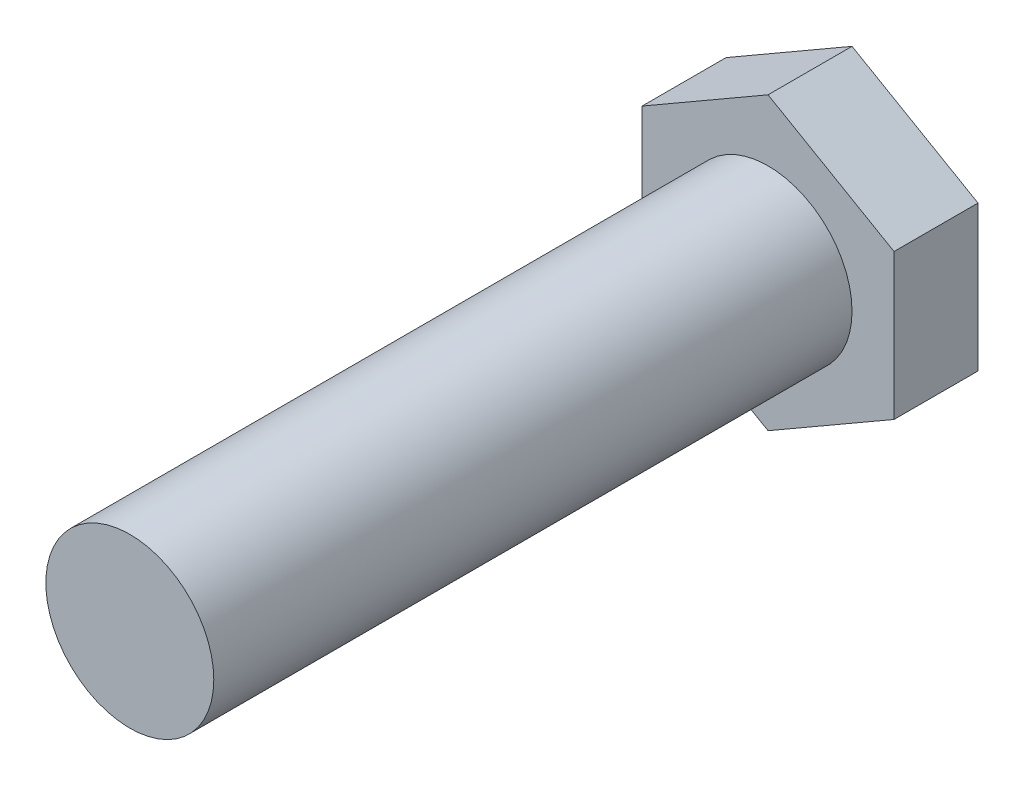
ISO-10303-21;
HEADER;
FILE_DESCRIPTION(('STEP AP214'),'2;1');
FILE_NAME('part.step','',(''),(''),'','','');
FILE_SCHEMA(('AUTOMOTIVE_DESIGN { 1 0 10303 214 1 1 1 1 }'));
ENDSEC;
DATA;
#1=APPLICATION_CONTEXT('core data for automotive mechanical design processes');
#2=APPLICATION_PROTOCOL_DEFINITION('international standard','automotive_design',2000,#1);
#3=PRODUCT_CONTEXT('',#1,'mechanical');
#4=PRODUCT('Part','Part','',(#3));
#5=PRODUCT_RELATED_PRODUCT_CATEGORY('part','',(#4));
#6=PRODUCT_DEFINITION_FORMATION('','',#4);
#7=PRODUCT_DEFINITION_CONTEXT('part definition',#1,'design');
#8=PRODUCT_DEFINITION('design','',#6,#7);
#9=PRODUCT_DEFINITION_SHAPE('','',#8);
#10=(LENGTH_UNIT() NAMED_UNIT(*) SI_UNIT(.MILLI.,.METRE.));
#11=(NAMED_UNIT(*) PLANE_ANGLE_UNIT() SI_UNIT($,.RADIAN.));
#12=(NAMED_UNIT(*) SI_UNIT($,.STERADIAN.) SOLID_ANGLE_UNIT());
#13=UNCERTAINTY_MEASURE_WITH_UNIT(LENGTH_MEASURE(1.E-05),#10,'distance_accuracy_value','');
#14=(GEOMETRIC_REPRESENTATION_CONTEXT(3) GLOBAL_UNCERTAINTY_ASSIGNED_CONTEXT((#13)) GLOBAL_UNIT_ASSIGNED_CONTEXT((#10,
#11,#12)) REPRESENTATION_CONTEXT('',''));
#15=CARTESIAN_POINT('',(0.,0.,0.));
#16=DIRECTION('',(0.,0.,1.));
#17=DIRECTION('',(1.,0.,0.));
#18=AXIS2_PLACEMENT_3D('',#15,#16,#17);
#19=CARTESIAN_POINT('',(7.5,4.3301270189222,5.));
#20=DIRECTION('',(-0.5,-0.866025403784439,0.));
#21=DIRECTION('',(0.866025403784439,-0.5,0.));
#22=AXIS2_PLACEMENT_3D('',#19,#20,#21);
#23=PLANE('',#22);
#24=DIRECTION('',(-0.866025403784439,0.5,0.));
#25=VECTOR('',#24,1.);
#26=CARTESIAN_POINT('',(7.5,4.3301270189222,0.));
#27=LINE('',#26,#25);
#28=CARTESIAN_POINT('',(7.5,4.3301270189222,0.));
#29=VERTEX_POINT('',#28);
#30=CARTESIAN_POINT('',(0.,8.66025403784439,0.));
#31=VERTEX_POINT('',#30);
#32=EDGE_CURVE('E129',#29,#31,#27,.T.);
#33=ORIENTED_EDGE('',*,*,#32,.T.);
#34=DIRECTION('',(0.,0.,-1.));
#35=VECTOR('',#34,1.);
#36=CARTESIAN_POINT('',(0.,8.66025403784439,5.));
#37=LINE('',#36,#35);
#38=CARTESIAN_POINT('',(0.,8.66025403784439,5.));
#39=VERTEX_POINT('',#38);
#40=EDGE_CURVE('E46',#39,#31,#37,.T.);
#41=ORIENTED_EDGE('',*,*,#40,.F.);
#42=DIRECTION('',(-0.866025403784439,0.5,0.));
#43=VECTOR('',#42,1.);
#44=CARTESIAN_POINT('',(7.5,4.3301270189222,5.));
#45=LINE('',#44,#43);
#46=CARTESIAN_POINT('',(7.5,4.3301270189222,5.));
#47=VERTEX_POINT('',#46);
#48=EDGE_CURVE('E140',#47,#39,#45,.T.);
#49=ORIENTED_EDGE('',*,*,#48,.F.);
#50=DIRECTION('',(0.,0.,-1.));
#51=VECTOR('',#50,1.);
#52=CARTESIAN_POINT('',(7.5,4.3301270189222,5.));
#53=LINE('',#52,#51);
#54=EDGE_CURVE('E125',#47,#29,#53,.T.);
#55=ORIENTED_EDGE('',*,*,#54,.T.);
#56=EDGE_LOOP('',(#33,#41,#49,#55));
#57=FACE_BOUND('',#56,.T.);
#58=ADVANCED_FACE('F43',(#57),#23,.F.);
#59=CARTESIAN_POINT('',(0.,8.66025403784439,5.));
#60=DIRECTION('',(0.5,-0.866025403784439,0.));
#61=DIRECTION('',(0.866025403784439,0.5,0.));
#62=AXIS2_PLACEMENT_3D('',#59,#60,#61);
#63=PLANE('',#62);
#64=DIRECTION('',(-0.866025403784439,-0.5,0.));
#65=VECTOR('',#64,1.);
#66=CARTESIAN_POINT('',(0.,8.66025403784439,0.));
#67=LINE('',#66,#65);
#68=CARTESIAN_POINT('',(-7.5,4.3301270189222,0.));
#69=VERTEX_POINT('',#68);
#70=EDGE_CURVE('E132',#31,#69,#67,.T.);
#71=ORIENTED_EDGE('',*,*,#70,.T.);
#72=DIRECTION('',(0.,0.,-1.));
#73=VECTOR('',#72,1.);
#74=CARTESIAN_POINT('',(-7.5,4.3301270189222,5.));
#75=LINE('',#74,#73);
#76=CARTESIAN_POINT('',(-7.5,4.3301270189222,5.));
#77=VERTEX_POINT('',#76);
#78=EDGE_CURVE('E143',#77,#69,#75,.T.);
#79=ORIENTED_EDGE('',*,*,#78,.F.);
#80=DIRECTION('',(-0.866025403784439,-0.5,0.));
#81=VECTOR('',#80,1.);
#82=CARTESIAN_POINT('',(0.,8.66025403784439,5.));
#83=LINE('',#82,#81);
#84=EDGE_CURVE('E98',#39,#77,#83,.T.);
#85=ORIENTED_EDGE('',*,*,#84,.F.);
#86=ORIENTED_EDGE('',*,*,#40,.T.);
#87=EDGE_LOOP('',(#71,#79,#85,#86));
#88=FACE_BOUND('',#87,.T.);
#89=ADVANCED_FACE('F148',(#88),#63,.F.);
#90=CARTESIAN_POINT('',(-7.5,4.3301270189222,5.));
#91=DIRECTION('',(1.,0.,0.));
#92=DIRECTION('',(0.,1.,0.));
#93=AXIS2_PLACEMENT_3D('',#90,#91,#92);
#94=PLANE('',#93);
#95=DIRECTION('',(0.,-1.,0.));
#96=VECTOR('',#95,1.);
#97=CARTESIAN_POINT('',(-7.5,4.3301270189222,0.));
#98=LINE('',#97,#96);
#99=CARTESIAN_POINT('',(-7.5,-4.33012701892219,0.));
#100=VERTEX_POINT('',#99);
#101=EDGE_CURVE('E135',#69,#100,#98,.T.);
#102=ORIENTED_EDGE('',*,*,#101,.T.);
#103=DIRECTION('',(0.,0.,-1.));
#104=VECTOR('',#103,1.);
#105=CARTESIAN_POINT('',(-7.5,-4.33012701892219,5.));
#106=LINE('',#105,#104);
#107=CARTESIAN_POINT('',(-7.5,-4.33012701892219,5.));
#108=VERTEX_POINT('',#107);
#109=EDGE_CURVE('E120',#108,#100,#106,.T.);
#110=ORIENTED_EDGE('',*,*,#109,.F.);
#111=DIRECTION('',(0.,-1.,0.));
#112=VECTOR('',#111,1.);
#113=CARTESIAN_POINT('',(-7.5,4.3301270189222,5.));
#114=LINE('',#113,#112);
#115=EDGE_CURVE('E111',#77,#108,#114,.T.);
#116=ORIENTED_EDGE('',*,*,#115,.F.);
#117=ORIENTED_EDGE('',*,*,#78,.T.);
#118=EDGE_LOOP('',(#102,#110,#116,#117));
#119=FACE_BOUND('',#118,.T.);
#120=ADVANCED_FACE('F154',(#119),#94,.F.);
#121=CARTESIAN_POINT('',(-7.5,-4.33012701892219,5.));
#122=DIRECTION('',(0.5,0.866025403784438,0.));
#123=DIRECTION('',(-0.866025403784438,0.5,0.));
#124=AXIS2_PLACEMENT_3D('',#121,#122,#123);
#125=PLANE('',#124);
#126=DIRECTION('',(0.866025403784439,-0.5,0.));
#127=VECTOR('',#126,1.);
#128=CARTESIAN_POINT('',(-7.5,-4.33012701892219,0.));
#129=LINE('',#128,#127);
#130=CARTESIAN_POINT('',(0.,-8.66025403784439,0.));
#131=VERTEX_POINT('',#130);
#132=EDGE_CURVE('E119',#100,#131,#129,.T.);
#133=ORIENTED_EDGE('',*,*,#132,.T.);
#134=DIRECTION('',(0.,0.,-1.));
#135=VECTOR('',#134,1.);
#136=CARTESIAN_POINT('',(0.,-8.66025403784439,5.));
#137=LINE('',#136,#135);
#138=CARTESIAN_POINT('',(0.,-8.66025403784439,5.));
#139=VERTEX_POINT('',#138);
#140=EDGE_CURVE('E116',#139,#131,#137,.T.);
#141=ORIENTED_EDGE('',*,*,#140,.F.);
#142=DIRECTION('',(0.866025403784439,-0.5,0.));
#143=VECTOR('',#142,1.);
#144=CARTESIAN_POINT('',(-7.5,-4.33012701892219,5.));
#145=LINE('',#144,#143);
#146=EDGE_CURVE('E105',#108,#139,#145,.T.);
#147=ORIENTED_EDGE('',*,*,#146,.F.);
#148=ORIENTED_EDGE('',*,*,#109,.T.);
#149=EDGE_LOOP('',(#133,#141,#147,#148));
#150=FACE_BOUND('',#149,.T.);
#151=ADVANCED_FACE('F117',(#150),#125,.F.);
#152=CARTESIAN_POINT('',(0.,-8.66025403784439,5.));
#153=DIRECTION('',(-0.5,0.866025403784439,0.));
#154=DIRECTION('',(-0.866025403784439,-0.5,0.));
#155=AXIS2_PLACEMENT_3D('',#152,#153,#154);
#156=PLANE('',#155);
#157=DIRECTION('',(0.866025403784439,0.5,0.));
#158=VECTOR('',#157,1.);
#159=CARTESIAN_POINT('',(0.,-8.66025403784439,0.));
#160=LINE('',#159,#158);
#161=CARTESIAN_POINT('',(7.5,-4.3301270189222,0.));
#162=VERTEX_POINT('',#161);
#163=EDGE_CURVE('E83',#131,#162,#160,.T.);
#164=ORIENTED_EDGE('',*,*,#163,.T.);
#165=DIRECTION('',(0.,0.,-1.));
#166=VECTOR('',#165,1.);
#167=CARTESIAN_POINT('',(7.5,-4.3301270189222,5.));
#168=LINE('',#167,#166);
#169=CARTESIAN_POINT('',(7.5,-4.3301270189222,5.));
#170=VERTEX_POINT('',#169);
#171=EDGE_CURVE('E121',#170,#162,#168,.T.);
#172=ORIENTED_EDGE('',*,*,#171,.F.);
#173=DIRECTION('',(0.866025403784439,0.5,0.));
#174=VECTOR('',#173,1.);
#175=CARTESIAN_POINT('',(0.,-8.66025403784439,5.));
#176=LINE('',#175,#174);
#177=EDGE_CURVE('E109',#139,#170,#176,.T.);
#178=ORIENTED_EDGE('',*,*,#177,.F.);
#179=ORIENTED_EDGE('',*,*,#140,.T.);
#180=EDGE_LOOP('',(#164,#172,#178,#179));
#181=FACE_BOUND('',#180,.T.);
#182=ADVANCED_FACE('F123',(#181),#156,.F.);
#183=CARTESIAN_POINT('',(7.5,-4.3301270189222,5.));
#184=DIRECTION('',(-1.,0.,0.));
#185=DIRECTION('',(0.,-1.,0.));
#186=AXIS2_PLACEMENT_3D('',#183,#184,#185);
#187=PLANE('',#186);
#188=DIRECTION('',(0.,1.,0.));
#189=VECTOR('',#188,1.);
#190=CARTESIAN_POINT('',(7.5,-4.3301270189222,0.));
#191=LINE('',#190,#189);
#192=EDGE_CURVE('E89',#162,#29,#191,.T.);
#193=ORIENTED_EDGE('',*,*,#192,.T.);
#194=ORIENTED_EDGE('',*,*,#54,.F.);
#195=DIRECTION('',(0.,1.,0.));
#196=VECTOR('',#195,1.);
#197=CARTESIAN_POINT('',(7.5,-4.3301270189222,5.));
#198=LINE('',#197,#196);
#199=EDGE_CURVE('E60',#170,#47,#198,.T.);
#200=ORIENTED_EDGE('',*,*,#199,.F.);
#201=ORIENTED_EDGE('',*,*,#171,.T.);
#202=EDGE_LOOP('',(#193,#194,#200,#201));
#203=FACE_BOUND('',#202,.T.);
#204=ADVANCED_FACE('F170',(#203),#187,.F.);
#205=CARTESIAN_POINT('',(0.,0.,5.));
#206=DIRECTION('',(0.,0.,1.));
#207=DIRECTION('',(1.,0.,0.));
#208=AXIS2_PLACEMENT_3D('',#205,#206,#207);
#209=PLANE('',#208);
#210=CARTESIAN_POINT('',(0.,0.,5.));
#211=DIRECTION('',(0.,0.,1.));
#212=DIRECTION('',(1.,0.,0.));
#213=AXIS2_PLACEMENT_3D('',#210,#211,#212);
#214=CIRCLE('',#213,5.);
#215=CARTESIAN_POINT('',(5.,0.,5.));
#216=VERTEX_POINT('',#215);
#217=EDGE_CURVE('E11',#216,#216,#214,.T.);
#218=ORIENTED_EDGE('',*,*,#217,.F.);
#219=EDGE_LOOP('',(#218));
#220=FACE_BOUND('',#219,.T.);
#221=ORIENTED_EDGE('',*,*,#48,.T.);
#222=ORIENTED_EDGE('',*,*,#84,.T.);
#223=ORIENTED_EDGE('',*,*,#115,.T.);
#224=ORIENTED_EDGE('',*,*,#146,.T.);
#225=ORIENTED_EDGE('',*,*,#177,.T.);
#226=ORIENTED_EDGE('',*,*,#199,.T.);
#227=EDGE_LOOP('',(#221,#222,#223,#224,#225,#226));
#228=FACE_BOUND('',#227,.T.);
#229=ADVANCED_FACE('F107',(#220,#228),#209,.T.);
#230=CARTESIAN_POINT('',(0.,0.,0.));
#231=DIRECTION('',(0.,0.,1.));
#232=DIRECTION('',(1.,0.,0.));
#233=AXIS2_PLACEMENT_3D('',#230,#231,#232);
#234=PLANE('',#233);
#235=ORIENTED_EDGE('',*,*,#32,.F.);
#236=ORIENTED_EDGE('',*,*,#192,.F.);
#237=ORIENTED_EDGE('',*,*,#163,.F.);
#238=ORIENTED_EDGE('',*,*,#132,.F.);
#239=ORIENTED_EDGE('',*,*,#101,.F.);
#240=ORIENTED_EDGE('',*,*,#70,.F.);
#241=EDGE_LOOP('',(#235,#236,#237,#238,#239,#240));
#242=FACE_BOUND('',#241,.T.);
#243=ADVANCED_FACE('F153',(#242),#234,.F.);
#244=CARTESIAN_POINT('',(0.,0.,43.));
#245=DIRECTION('',(0.,0.,-1.));
#246=DIRECTION('',(-1.,0.,0.));
#247=AXIS2_PLACEMENT_3D('',#244,#245,#246);
#248=CYLINDRICAL_SURFACE('',#247,5.);
#249=CARTESIAN_POINT('',(0.,0.,43.));
#250=DIRECTION('',(0.,0.,1.));
#251=DIRECTION('',(1.,0.,0.));
#252=AXIS2_PLACEMENT_3D('',#249,#250,#251);
#253=CIRCLE('',#252,5.);
#254=CARTESIAN_POINT('',(5.,0.,43.));
#255=VERTEX_POINT('',#254);
#256=EDGE_CURVE('E133',#255,#255,#253,.T.);
#257=ORIENTED_EDGE('',*,*,#256,.F.);
#258=EDGE_LOOP('',(#257));
#259=FACE_BOUND('',#258,.T.);
#260=ORIENTED_EDGE('',*,*,#217,.T.);
#261=EDGE_LOOP('',(#260));
#262=FACE_BOUND('',#261,.T.);
#263=ADVANCED_FACE('F163',(#259,#262),#248,.T.);
#264=CARTESIAN_POINT('',(0.,0.,43.));
#265=DIRECTION('',(0.,0.,1.));
#266=DIRECTION('',(1.,0.,0.));
#267=AXIS2_PLACEMENT_3D('',#264,#265,#266);
#268=PLANE('',#267);
#269=ORIENTED_EDGE('',*,*,#256,.T.);
#270=EDGE_LOOP('',(#269));
#271=FACE_BOUND('',#270,.T.);
#272=ADVANCED_FACE('F161',(#271),#268,.T.);
#273=CLOSED_SHELL('',(#58,#89,#120,#151,#182,#204,#229,#243,#263,#272));
#274=MANIFOLD_SOLID_BREP('B2',#273);
#275=ADVANCED_BREP_SHAPE_REPRESENTATION('',(#18,#274),#14);
#276=SHAPE_DEFINITION_REPRESENTATION(#9,#275);
ENDSEC;
END-ISO-10303-21;
